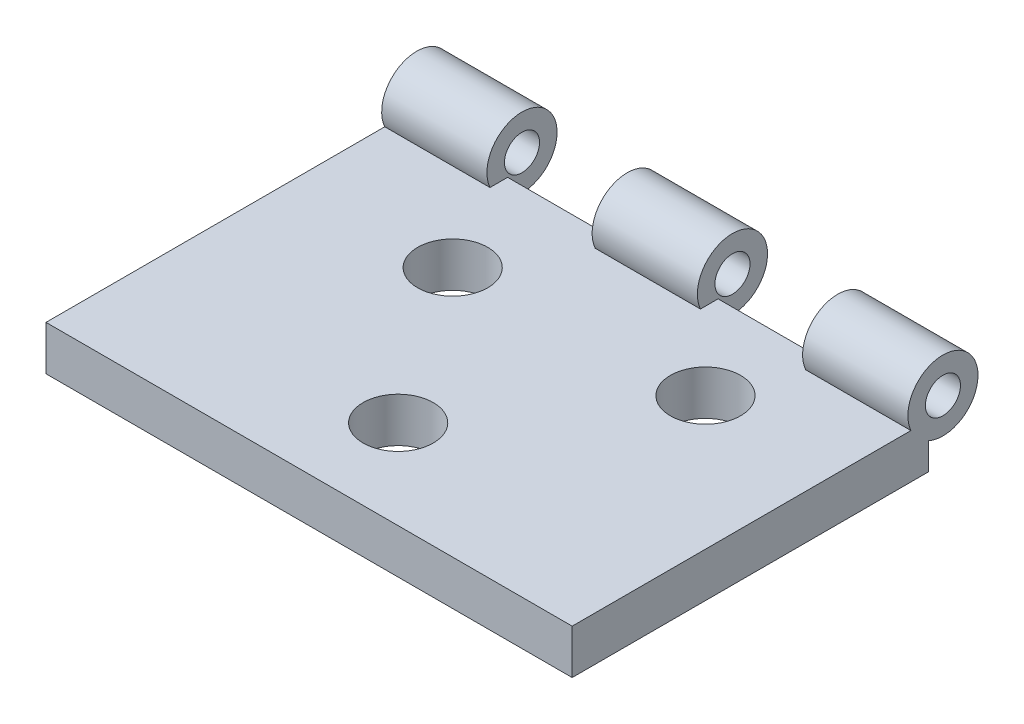
ISO-10303-21;
HEADER;
FILE_DESCRIPTION(('STEP AP214'),'2;1');
FILE_NAME('part.step','',(''),(''),'','','');
FILE_SCHEMA(('AUTOMOTIVE_DESIGN { 1 0 10303 214 1 1 1 1 }'));
ENDSEC;
DATA;
#1=APPLICATION_CONTEXT('core data for automotive mechanical design processes');
#2=APPLICATION_PROTOCOL_DEFINITION('international standard','automotive_design',2000,#1);
#3=PRODUCT_CONTEXT('',#1,'mechanical');
#4=PRODUCT('Part','Part','',(#3));
#5=PRODUCT_RELATED_PRODUCT_CATEGORY('part','',(#4));
#6=PRODUCT_DEFINITION_FORMATION('','',#4);
#7=PRODUCT_DEFINITION_CONTEXT('part definition',#1,'design');
#8=PRODUCT_DEFINITION('design','',#6,#7);
#9=PRODUCT_DEFINITION_SHAPE('','',#8);
#10=(LENGTH_UNIT() NAMED_UNIT(*) SI_UNIT(.MILLI.,.METRE.));
#11=(NAMED_UNIT(*) PLANE_ANGLE_UNIT() SI_UNIT($,.RADIAN.));
#12=(NAMED_UNIT(*) SI_UNIT($,.STERADIAN.) SOLID_ANGLE_UNIT());
#13=UNCERTAINTY_MEASURE_WITH_UNIT(LENGTH_MEASURE(1.E-05),#10,'distance_accuracy_value','');
#14=(GEOMETRIC_REPRESENTATION_CONTEXT(3) GLOBAL_UNCERTAINTY_ASSIGNED_CONTEXT((#13)) GLOBAL_UNIT_ASSIGNED_CONTEXT((#10,
#11,#12)) REPRESENTATION_CONTEXT('',''));
#15=CARTESIAN_POINT('',(0.,0.,0.));
#16=DIRECTION('',(0.,0.,1.));
#17=DIRECTION('',(1.,0.,0.));
#18=AXIS2_PLACEMENT_3D('',#15,#16,#17);
#19=CARTESIAN_POINT('',(0.,6.35,-25.4));
#20=DIRECTION('',(0.,0.,-1.));
#21=DIRECTION('',(-1.,0.,0.));
#22=AXIS2_PLACEMENT_3D('',#19,#20,#21);
#23=PLANE('',#22);
#24=DIRECTION('',(-1.,0.,0.));
#25=VECTOR('',#24,1.);
#26=CARTESIAN_POINT('',(37.5,3.83737281295908,-25.4));
#27=LINE('',#26,#25);
#28=CARTESIAN_POINT('',(37.5,3.83737281295907,-25.4));
#29=VERTEX_POINT('',#28);
#30=CARTESIAN_POINT('',(22.5,3.83737281295908,-25.4));
#31=VERTEX_POINT('',#30);
#32=EDGE_CURVE('E135',#29,#31,#27,.T.);
#33=ORIENTED_EDGE('',*,*,#32,.F.);
#34=DIRECTION('',(0.,-1.,0.));
#35=VECTOR('',#34,1.);
#36=CARTESIAN_POINT('',(37.5,6.35,-25.4));
#37=LINE('',#36,#35);
#38=CARTESIAN_POINT('',(37.5,0.,-25.4));
#39=VERTEX_POINT('',#38);
#40=EDGE_CURVE('E247',#29,#39,#37,.T.);
#41=ORIENTED_EDGE('',*,*,#40,.T.);
#42=DIRECTION('',(1.,0.,0.));
#43=VECTOR('',#42,1.);
#44=CARTESIAN_POINT('',(0.,0.,-25.4));
#45=LINE('',#44,#43);
#46=CARTESIAN_POINT('',(-37.5,0.,-25.4));
#47=VERTEX_POINT('',#46);
#48=EDGE_CURVE('E230',#47,#39,#45,.T.);
#49=ORIENTED_EDGE('',*,*,#48,.F.);
#50=DIRECTION('',(0.,-1.,0.));
#51=VECTOR('',#50,1.);
#52=CARTESIAN_POINT('',(-37.5,6.35,-25.4));
#53=LINE('',#52,#51);
#54=CARTESIAN_POINT('',(-37.5,3.83737281295908,-25.4));
#55=VERTEX_POINT('',#54);
#56=EDGE_CURVE('E219',#55,#47,#53,.T.);
#57=ORIENTED_EDGE('',*,*,#56,.F.);
#58=DIRECTION('',(-1.,0.,0.));
#59=VECTOR('',#58,1.);
#60=CARTESIAN_POINT('',(-22.5,3.83737281295908,-25.4));
#61=LINE('',#60,#59);
#62=CARTESIAN_POINT('',(-22.5,3.83737281295908,-25.4));
#63=VERTEX_POINT('',#62);
#64=EDGE_CURVE('E188',#63,#55,#61,.T.);
#65=ORIENTED_EDGE('',*,*,#64,.F.);
#66=DIRECTION('',(0.,1.,0.));
#67=VECTOR('',#66,1.);
#68=CARTESIAN_POINT('',(-22.5,6.35,-25.4));
#69=LINE('',#68,#67);
#70=CARTESIAN_POINT('',(-22.5,6.35,-25.4));
#71=VERTEX_POINT('',#70);
#72=EDGE_CURVE('E181',#63,#71,#69,.T.);
#73=ORIENTED_EDGE('',*,*,#72,.T.);
#74=DIRECTION('',(1.,0.,0.));
#75=VECTOR('',#74,1.);
#76=CARTESIAN_POINT('',(0.,6.35,-25.4));
#77=LINE('',#76,#75);
#78=CARTESIAN_POINT('',(-7.5,6.35,-25.4));
#79=VERTEX_POINT('',#78);
#80=EDGE_CURVE('E203',#71,#79,#77,.T.);
#81=ORIENTED_EDGE('',*,*,#80,.T.);
#82=DIRECTION('',(0.,1.,0.));
#83=VECTOR('',#82,1.);
#84=CARTESIAN_POINT('',(-7.5,6.35,-25.4));
#85=LINE('',#84,#83);
#86=CARTESIAN_POINT('',(-7.5,3.83737281295908,-25.4));
#87=VERTEX_POINT('',#86);
#88=EDGE_CURVE('E162',#87,#79,#85,.T.);
#89=ORIENTED_EDGE('',*,*,#88,.F.);
#90=DIRECTION('',(-1.,0.,0.));
#91=VECTOR('',#90,1.);
#92=CARTESIAN_POINT('',(7.5,3.83737281295908,-25.4));
#93=LINE('',#92,#91);
#94=CARTESIAN_POINT('',(7.5,3.83737281295908,-25.4));
#95=VERTEX_POINT('',#94);
#96=EDGE_CURVE('E172',#95,#87,#93,.T.);
#97=ORIENTED_EDGE('',*,*,#96,.F.);
#98=DIRECTION('',(0.,1.,0.));
#99=VECTOR('',#98,1.);
#100=CARTESIAN_POINT('',(7.5,6.35,-25.4));
#101=LINE('',#100,#99);
#102=CARTESIAN_POINT('',(7.5,6.35,-25.4));
#103=VERTEX_POINT('',#102);
#104=EDGE_CURVE('E169',#95,#103,#101,.T.);
#105=ORIENTED_EDGE('',*,*,#104,.T.);
#106=CARTESIAN_POINT('',(22.5,6.35,-25.4));
#107=VERTEX_POINT('',#106);
#108=EDGE_CURVE('E202',#103,#107,#77,.T.);
#109=ORIENTED_EDGE('',*,*,#108,.T.);
#110=DIRECTION('',(0.,1.,0.));
#111=VECTOR('',#110,1.);
#112=CARTESIAN_POINT('',(22.5,6.35,-25.4));
#113=LINE('',#112,#111);
#114=EDGE_CURVE('E60',#31,#107,#113,.T.);
#115=ORIENTED_EDGE('',*,*,#114,.F.);
#116=EDGE_LOOP('',(#33,#41,#49,#57,#65,#73,#81,#89,#97,#105,#109,#115));
#117=FACE_BOUND('',#116,.T.);
#118=ADVANCED_FACE('F43',(#117),#23,.T.);
#119=CARTESIAN_POINT('',(0.,6.35,0.));
#120=DIRECTION('',(0.,1.,0.));
#121=DIRECTION('',(0.,0.,1.));
#122=AXIS2_PLACEMENT_3D('',#119,#120,#121);
#123=PLANE('',#122);
#124=DIRECTION('',(-1.,0.,0.));
#125=VECTOR('',#124,1.);
#126=CARTESIAN_POINT('',(37.5,6.35,-22.8873728129591));
#127=LINE('',#126,#125);
#128=CARTESIAN_POINT('',(22.5,6.35,-22.8873728129591));
#129=VERTEX_POINT('',#128);
#130=CARTESIAN_POINT('',(37.5,6.35,-22.8873728129591));
#131=VERTEX_POINT('',#130);
#132=EDGE_CURVE('E125',#129,#131,#127,.F.);
#133=ORIENTED_EDGE('',*,*,#132,.F.);
#134=DIRECTION('',(0.,0.,1.));
#135=VECTOR('',#134,1.);
#136=CARTESIAN_POINT('',(22.5,6.35,0.));
#137=LINE('',#136,#135);
#138=EDGE_CURVE('E11',#107,#129,#137,.T.);
#139=ORIENTED_EDGE('',*,*,#138,.F.);
#140=ORIENTED_EDGE('',*,*,#108,.F.);
#141=DIRECTION('',(0.,0.,1.));
#142=VECTOR('',#141,1.);
#143=CARTESIAN_POINT('',(7.5,6.35,0.));
#144=LINE('',#143,#142);
#145=CARTESIAN_POINT('',(7.5,6.35,-22.8873728129591));
#146=VERTEX_POINT('',#145);
#147=EDGE_CURVE('E53',#103,#146,#144,.T.);
#148=ORIENTED_EDGE('',*,*,#147,.T.);
#149=DIRECTION('',(-1.,0.,0.));
#150=VECTOR('',#149,1.);
#151=CARTESIAN_POINT('',(7.5,6.35,-22.8873728129591));
#152=LINE('',#151,#150);
#153=CARTESIAN_POINT('',(-7.5,6.35,-22.8873728129591));
#154=VERTEX_POINT('',#153);
#155=EDGE_CURVE('E268',#154,#146,#152,.F.);
#156=ORIENTED_EDGE('',*,*,#155,.F.);
#157=DIRECTION('',(0.,0.,1.));
#158=VECTOR('',#157,1.);
#159=CARTESIAN_POINT('',(-7.5,6.35,0.));
#160=LINE('',#159,#158);
#161=EDGE_CURVE('E264',#79,#154,#160,.T.);
#162=ORIENTED_EDGE('',*,*,#161,.F.);
#163=ORIENTED_EDGE('',*,*,#80,.F.);
#164=DIRECTION('',(0.,0.,1.));
#165=VECTOR('',#164,1.);
#166=CARTESIAN_POINT('',(-22.5,6.35,0.));
#167=LINE('',#166,#165);
#168=CARTESIAN_POINT('',(-22.5,6.35,-22.8873728129591));
#169=VERTEX_POINT('',#168);
#170=EDGE_CURVE('E257',#71,#169,#167,.T.);
#171=ORIENTED_EDGE('',*,*,#170,.T.);
#172=DIRECTION('',(-1.,0.,0.));
#173=VECTOR('',#172,1.);
#174=CARTESIAN_POINT('',(-22.5,6.35,-22.8873728129591));
#175=LINE('',#174,#173);
#176=CARTESIAN_POINT('',(-37.5,6.35,-22.8873728129591));
#177=VERTEX_POINT('',#176);
#178=EDGE_CURVE('E261',#177,#169,#175,.F.);
#179=ORIENTED_EDGE('',*,*,#178,.F.);
#180=DIRECTION('',(0.,0.,-1.));
#181=VECTOR('',#180,1.);
#182=CARTESIAN_POINT('',(-37.5,6.35,0.));
#183=LINE('',#182,#181);
#184=CARTESIAN_POINT('',(-37.5,6.35,25.4));
#185=VERTEX_POINT('',#184);
#186=EDGE_CURVE('E192',#185,#177,#183,.T.);
#187=ORIENTED_EDGE('',*,*,#186,.F.);
#188=DIRECTION('',(1.,0.,0.));
#189=VECTOR('',#188,1.);
#190=CARTESIAN_POINT('',(0.,6.35,25.4));
#191=LINE('',#190,#189);
#192=CARTESIAN_POINT('',(37.5,6.35,25.4));
#193=VERTEX_POINT('',#192);
#194=EDGE_CURVE('E196',#185,#193,#191,.T.);
#195=ORIENTED_EDGE('',*,*,#194,.T.);
#196=DIRECTION('',(0.,0.,-1.));
#197=VECTOR('',#196,1.);
#198=CARTESIAN_POINT('',(37.5,6.35,0.));
#199=LINE('',#198,#197);
#200=EDGE_CURVE('E129',#193,#131,#199,.T.);
#201=ORIENTED_EDGE('',*,*,#200,.T.);
#202=EDGE_LOOP('',(#133,#139,#140,#148,#156,#162,#163,#171,#179,#187,#195,#201));
#203=FACE_BOUND('',#202,.T.);
#204=CARTESIAN_POINT('',(0.,6.35,12.7));
#205=DIRECTION('',(0.,1.,0.));
#206=DIRECTION('',(0.,0.,1.));
#207=AXIS2_PLACEMENT_3D('',#204,#205,#206);
#208=CIRCLE('',#207,5.);
#209=CARTESIAN_POINT('',(0.,6.35,17.7));
#210=VERTEX_POINT('',#209);
#211=EDGE_CURVE('E207',#210,#210,#208,.T.);
#212=ORIENTED_EDGE('',*,*,#211,.F.);
#213=EDGE_LOOP('',(#212));
#214=FACE_BOUND('',#213,.T.);
#215=CARTESIAN_POINT('',(18.5438369736078,6.35,-12.5603589101237));
#216=DIRECTION('',(0.,1.,0.));
#217=DIRECTION('',(0.,0.,1.));
#218=AXIS2_PLACEMENT_3D('',#215,#216,#217);
#219=CIRCLE('',#218,5.);
#220=CARTESIAN_POINT('',(18.5438369736078,6.35,-7.56035891012367));
#221=VERTEX_POINT('',#220);
#222=EDGE_CURVE('E211',#221,#221,#219,.T.);
#223=ORIENTED_EDGE('',*,*,#222,.F.);
#224=EDGE_LOOP('',(#223));
#225=FACE_BOUND('',#224,.T.);
#226=CARTESIAN_POINT('',(-15.2791730334857,6.35,-10.3490932013476));
#227=DIRECTION('',(0.,1.,0.));
#228=DIRECTION('',(0.,0.,1.));
#229=AXIS2_PLACEMENT_3D('',#226,#227,#228);
#230=CIRCLE('',#229,5.);
#231=CARTESIAN_POINT('',(-15.2791730334857,6.35,-5.34909320134763));
#232=VERTEX_POINT('',#231);
#233=EDGE_CURVE('E215',#232,#232,#230,.T.);
#234=ORIENTED_EDGE('',*,*,#233,.F.);
#235=EDGE_LOOP('',(#234));
#236=FACE_BOUND('',#235,.T.);
#237=ADVANCED_FACE('F126',(#203,#214,#225,#236),#123,.T.);
#238=CARTESIAN_POINT('',(-37.5,6.35,0.));
#239=DIRECTION('',(-1.,0.,0.));
#240=DIRECTION('',(0.,0.,1.));
#241=AXIS2_PLACEMENT_3D('',#238,#239,#240);
#242=PLANE('',#241);
#243=CARTESIAN_POINT('',(-37.5,8.39848233886866,-27.4484823388687));
#244=DIRECTION('',(-1.,0.,0.));
#245=DIRECTION('',(0.,0.,1.));
#246=AXIS2_PLACEMENT_3D('',#243,#244,#245);
#247=CIRCLE('',#246,2.5);
#248=CARTESIAN_POINT('',(-37.5,8.39848233886866,-24.9484823388687));
#249=VERTEX_POINT('',#248);
#250=EDGE_CURVE('E346',#249,#249,#247,.T.);
#251=ORIENTED_EDGE('',*,*,#250,.F.);
#252=EDGE_LOOP('',(#251));
#253=FACE_BOUND('',#252,.T.);
#254=ORIENTED_EDGE('',*,*,#186,.T.);
#255=CARTESIAN_POINT('',(-37.5,8.39848233886866,-27.4484823388687));
#256=DIRECTION('',(-1.,0.,0.));
#257=DIRECTION('',(0.,0.,1.));
#258=AXIS2_PLACEMENT_3D('',#255,#256,#257);
#259=CIRCLE('',#258,5.);
#260=EDGE_CURVE('E176',#177,#55,#259,.T.);
#261=ORIENTED_EDGE('',*,*,#260,.T.);
#262=ORIENTED_EDGE('',*,*,#56,.T.);
#263=DIRECTION('',(0.,0.,-1.));
#264=VECTOR('',#263,1.);
#265=CARTESIAN_POINT('',(-37.5,0.,0.));
#266=LINE('',#265,#264);
#267=CARTESIAN_POINT('',(-37.5,0.,25.4));
#268=VERTEX_POINT('',#267);
#269=EDGE_CURVE('E191',#268,#47,#266,.T.);
#270=ORIENTED_EDGE('',*,*,#269,.F.);
#271=DIRECTION('',(0.,-1.,0.));
#272=VECTOR('',#271,1.);
#273=CARTESIAN_POINT('',(-37.5,6.35,25.4));
#274=LINE('',#273,#272);
#275=EDGE_CURVE('E254',#185,#268,#274,.T.);
#276=ORIENTED_EDGE('',*,*,#275,.F.);
#277=EDGE_LOOP('',(#254,#261,#262,#270,#276));
#278=FACE_BOUND('',#277,.T.);
#279=ADVANCED_FACE('F45',(#253,#278),#242,.T.);
#280=CARTESIAN_POINT('',(0.,6.35,25.4));
#281=DIRECTION('',(0.,0.,-1.));
#282=DIRECTION('',(-1.,0.,0.));
#283=AXIS2_PLACEMENT_3D('',#280,#281,#282);
#284=PLANE('',#283);
#285=DIRECTION('',(1.,0.,0.));
#286=VECTOR('',#285,1.);
#287=CARTESIAN_POINT('',(0.,0.,25.4));
#288=LINE('',#287,#286);
#289=CARTESIAN_POINT('',(37.5,0.,25.4));
#290=VERTEX_POINT('',#289);
#291=EDGE_CURVE('E223',#268,#290,#288,.T.);
#292=ORIENTED_EDGE('',*,*,#291,.T.);
#293=DIRECTION('',(0.,-1.,0.));
#294=VECTOR('',#293,1.);
#295=CARTESIAN_POINT('',(37.5,6.35,25.4));
#296=LINE('',#295,#294);
#297=EDGE_CURVE('E250',#193,#290,#296,.T.);
#298=ORIENTED_EDGE('',*,*,#297,.F.);
#299=ORIENTED_EDGE('',*,*,#194,.F.);
#300=ORIENTED_EDGE('',*,*,#275,.T.);
#301=EDGE_LOOP('',(#292,#298,#299,#300));
#302=FACE_BOUND('',#301,.T.);
#303=ADVANCED_FACE('F299',(#302),#284,.F.);
#304=CARTESIAN_POINT('',(37.5,6.35,0.));
#305=DIRECTION('',(-1.,0.,0.));
#306=DIRECTION('',(0.,0.,1.));
#307=AXIS2_PLACEMENT_3D('',#304,#305,#306);
#308=PLANE('',#307);
#309=CARTESIAN_POINT('',(37.5,8.39848233886866,-27.4484823388687));
#310=DIRECTION('',(-1.,0.,0.));
#311=DIRECTION('',(0.,0.,1.));
#312=AXIS2_PLACEMENT_3D('',#309,#310,#311);
#313=CIRCLE('',#312,2.5);
#314=CARTESIAN_POINT('',(37.5,8.39848233886866,-24.9484823388687));
#315=VERTEX_POINT('',#314);
#316=EDGE_CURVE('E349',#315,#315,#313,.T.);
#317=ORIENTED_EDGE('',*,*,#316,.T.);
#318=EDGE_LOOP('',(#317));
#319=FACE_BOUND('',#318,.T.);
#320=ORIENTED_EDGE('',*,*,#40,.F.);
#321=CARTESIAN_POINT('',(37.5,8.39848233886866,-27.4484823388687));
#322=DIRECTION('',(-1.,0.,0.));
#323=DIRECTION('',(0.,0.,1.));
#324=AXIS2_PLACEMENT_3D('',#321,#322,#323);
#325=CIRCLE('',#324,5.);
#326=EDGE_CURVE('E136',#131,#29,#325,.T.);
#327=ORIENTED_EDGE('',*,*,#326,.F.);
#328=ORIENTED_EDGE('',*,*,#200,.F.);
#329=ORIENTED_EDGE('',*,*,#297,.T.);
#330=DIRECTION('',(0.,0.,-1.));
#331=VECTOR('',#330,1.);
#332=CARTESIAN_POINT('',(37.5,0.,0.));
#333=LINE('',#332,#331);
#334=EDGE_CURVE('E226',#290,#39,#333,.T.);
#335=ORIENTED_EDGE('',*,*,#334,.T.);
#336=EDGE_LOOP('',(#320,#327,#328,#329,#335));
#337=FACE_BOUND('',#336,.T.);
#338=ADVANCED_FACE('F303',(#319,#337),#308,.F.);
#339=CARTESIAN_POINT('',(18.5438369736078,6.35,-12.5603589101237));
#340=DIRECTION('',(0.,-1.,0.));
#341=DIRECTION('',(0.,0.,-1.));
#342=AXIS2_PLACEMENT_3D('',#339,#340,#341);
#343=CYLINDRICAL_SURFACE('',#342,5.);
#344=ORIENTED_EDGE('',*,*,#222,.T.);
#345=EDGE_LOOP('',(#344));
#346=FACE_BOUND('',#345,.T.);
#347=CARTESIAN_POINT('',(18.5438369736078,0.,-12.5603589101237));
#348=DIRECTION('',(0.,1.,0.));
#349=DIRECTION('',(0.,0.,1.));
#350=AXIS2_PLACEMENT_3D('',#347,#348,#349);
#351=CIRCLE('',#350,5.);
#352=CARTESIAN_POINT('',(18.5438369736078,0.,-7.56035891012367));
#353=VERTEX_POINT('',#352);
#354=EDGE_CURVE('E238',#353,#353,#351,.T.);
#355=ORIENTED_EDGE('',*,*,#354,.F.);
#356=EDGE_LOOP('',(#355));
#357=FACE_BOUND('',#356,.T.);
#358=ADVANCED_FACE('F324',(#346,#357),#343,.F.);
#359=CARTESIAN_POINT('',(0.,6.35,12.7));
#360=DIRECTION('',(0.,-1.,0.));
#361=DIRECTION('',(0.,0.,-1.));
#362=AXIS2_PLACEMENT_3D('',#359,#360,#361);
#363=CYLINDRICAL_SURFACE('',#362,5.);
#364=ORIENTED_EDGE('',*,*,#211,.T.);
#365=EDGE_LOOP('',(#364));
#366=FACE_BOUND('',#365,.T.);
#367=CARTESIAN_POINT('',(0.,0.,12.7));
#368=DIRECTION('',(0.,1.,0.));
#369=DIRECTION('',(0.,0.,1.));
#370=AXIS2_PLACEMENT_3D('',#367,#368,#369);
#371=CIRCLE('',#370,5.);
#372=CARTESIAN_POINT('',(0.,0.,17.7));
#373=VERTEX_POINT('',#372);
#374=EDGE_CURVE('E234',#373,#373,#371,.T.);
#375=ORIENTED_EDGE('',*,*,#374,.F.);
#376=EDGE_LOOP('',(#375));
#377=FACE_BOUND('',#376,.T.);
#378=ADVANCED_FACE('F318',(#366,#377),#363,.F.);
#379=CARTESIAN_POINT('',(-15.2791730334857,6.35,-10.3490932013476));
#380=DIRECTION('',(0.,-1.,0.));
#381=DIRECTION('',(0.,0.,-1.));
#382=AXIS2_PLACEMENT_3D('',#379,#380,#381);
#383=CYLINDRICAL_SURFACE('',#382,5.);
#384=ORIENTED_EDGE('',*,*,#233,.T.);
#385=EDGE_LOOP('',(#384));
#386=FACE_BOUND('',#385,.T.);
#387=CARTESIAN_POINT('',(-15.2791730334857,0.,-10.3490932013476));
#388=DIRECTION('',(0.,1.,0.));
#389=DIRECTION('',(0.,0.,1.));
#390=AXIS2_PLACEMENT_3D('',#387,#388,#389);
#391=CIRCLE('',#390,5.);
#392=CARTESIAN_POINT('',(-15.2791730334857,0.,-5.34909320134763));
#393=VERTEX_POINT('',#392);
#394=EDGE_CURVE('E197',#393,#393,#391,.T.);
#395=ORIENTED_EDGE('',*,*,#394,.F.);
#396=EDGE_LOOP('',(#395));
#397=FACE_BOUND('',#396,.T.);
#398=ADVANCED_FACE('F309',(#386,#397),#383,.F.);
#399=CARTESIAN_POINT('',(0.,0.,0.));
#400=DIRECTION('',(0.,1.,0.));
#401=DIRECTION('',(0.,0.,1.));
#402=AXIS2_PLACEMENT_3D('',#399,#400,#401);
#403=PLANE('',#402);
#404=ORIENTED_EDGE('',*,*,#269,.T.);
#405=ORIENTED_EDGE('',*,*,#48,.T.);
#406=ORIENTED_EDGE('',*,*,#334,.F.);
#407=ORIENTED_EDGE('',*,*,#291,.F.);
#408=EDGE_LOOP('',(#404,#405,#406,#407));
#409=FACE_BOUND('',#408,.T.);
#410=ORIENTED_EDGE('',*,*,#374,.T.);
#411=EDGE_LOOP('',(#410));
#412=FACE_BOUND('',#411,.T.);
#413=ORIENTED_EDGE('',*,*,#354,.T.);
#414=EDGE_LOOP('',(#413));
#415=FACE_BOUND('',#414,.T.);
#416=ORIENTED_EDGE('',*,*,#394,.T.);
#417=EDGE_LOOP('',(#416));
#418=FACE_BOUND('',#417,.T.);
#419=ADVANCED_FACE('F306',(#409,#412,#415,#418),#403,.F.);
#420=CARTESIAN_POINT('',(-22.5,8.39848233886866,-27.4484823388687));
#421=DIRECTION('',(-1.,0.,0.));
#422=DIRECTION('',(0.,0.,1.));
#423=AXIS2_PLACEMENT_3D('',#420,#421,#422);
#424=CYLINDRICAL_SURFACE('',#423,5.);
#425=CARTESIAN_POINT('',(-22.5,8.39848233886866,-27.4484823388687));
#426=DIRECTION('',(-1.,0.,0.));
#427=DIRECTION('',(0.,0.,1.));
#428=AXIS2_PLACEMENT_3D('',#425,#426,#427);
#429=CIRCLE('',#428,5.);
#430=EDGE_CURVE('E177',#169,#63,#429,.T.);
#431=ORIENTED_EDGE('',*,*,#430,.T.);
#432=ORIENTED_EDGE('',*,*,#64,.T.);
#433=ORIENTED_EDGE('',*,*,#260,.F.);
#434=ORIENTED_EDGE('',*,*,#178,.T.);
#435=EDGE_LOOP('',(#431,#432,#433,#434));
#436=FACE_BOUND('',#435,.T.);
#437=ADVANCED_FACE('F290',(#436),#424,.T.);
#438=CARTESIAN_POINT('',(-22.5,8.39848233886866,-27.4484823388687));
#439=DIRECTION('',(-1.,0.,0.));
#440=DIRECTION('',(0.,0.,1.));
#441=AXIS2_PLACEMENT_3D('',#438,#439,#440);
#442=PLANE('',#441);
#443=CARTESIAN_POINT('',(-22.5,8.39848233886866,-27.4484823388687));
#444=DIRECTION('',(-1.,0.,0.));
#445=DIRECTION('',(0.,0.,1.));
#446=AXIS2_PLACEMENT_3D('',#443,#444,#445);
#447=CIRCLE('',#446,2.5);
#448=CARTESIAN_POINT('',(-22.5,8.39848233886866,-24.9484823388687));
#449=VERTEX_POINT('',#448);
#450=EDGE_CURVE('E144',#449,#449,#447,.T.);
#451=ORIENTED_EDGE('',*,*,#450,.T.);
#452=EDGE_LOOP('',(#451));
#453=FACE_BOUND('',#452,.T.);
#454=ORIENTED_EDGE('',*,*,#72,.F.);
#455=ORIENTED_EDGE('',*,*,#430,.F.);
#456=ORIENTED_EDGE('',*,*,#170,.F.);
#457=EDGE_LOOP('',(#454,#455,#456));
#458=FACE_BOUND('',#457,.T.);
#459=ADVANCED_FACE('F288',(#453,#458),#442,.F.);
#460=CARTESIAN_POINT('',(7.5,8.39848233886866,-27.4484823388687));
#461=DIRECTION('',(-1.,0.,0.));
#462=DIRECTION('',(0.,0.,1.));
#463=AXIS2_PLACEMENT_3D('',#460,#461,#462);
#464=CYLINDRICAL_SURFACE('',#463,5.);
#465=CARTESIAN_POINT('',(7.5,8.39848233886866,-27.4484823388687));
#466=DIRECTION('',(-1.,0.,0.));
#467=DIRECTION('',(0.,0.,1.));
#468=AXIS2_PLACEMENT_3D('',#465,#466,#467);
#469=CIRCLE('',#468,5.);
#470=EDGE_CURVE('E158',#146,#95,#469,.T.);
#471=ORIENTED_EDGE('',*,*,#470,.T.);
#472=ORIENTED_EDGE('',*,*,#96,.T.);
#473=CARTESIAN_POINT('',(-7.5,8.39848233886866,-27.4484823388687));
#474=DIRECTION('',(-1.,0.,0.));
#475=DIRECTION('',(0.,0.,1.));
#476=AXIS2_PLACEMENT_3D('',#473,#474,#475);
#477=CIRCLE('',#476,5.);
#478=EDGE_CURVE('E157',#154,#87,#477,.T.);
#479=ORIENTED_EDGE('',*,*,#478,.F.);
#480=ORIENTED_EDGE('',*,*,#155,.T.);
#481=EDGE_LOOP('',(#471,#472,#479,#480));
#482=FACE_BOUND('',#481,.T.);
#483=ADVANCED_FACE('F279',(#482),#464,.T.);
#484=CARTESIAN_POINT('',(7.5,8.39848233886866,-27.4484823388687));
#485=DIRECTION('',(-1.,0.,0.));
#486=DIRECTION('',(0.,0.,1.));
#487=AXIS2_PLACEMENT_3D('',#484,#485,#486);
#488=PLANE('',#487);
#489=CARTESIAN_POINT('',(7.5,8.39848233886866,-27.4484823388687));
#490=DIRECTION('',(-1.,0.,0.));
#491=DIRECTION('',(0.,0.,1.));
#492=AXIS2_PLACEMENT_3D('',#489,#490,#491);
#493=CIRCLE('',#492,2.5);
#494=CARTESIAN_POINT('',(7.5,8.39848233886866,-24.9484823388687));
#495=VERTEX_POINT('',#494);
#496=EDGE_CURVE('E150',#495,#495,#493,.T.);
#497=ORIENTED_EDGE('',*,*,#496,.T.);
#498=EDGE_LOOP('',(#497));
#499=FACE_BOUND('',#498,.T.);
#500=ORIENTED_EDGE('',*,*,#104,.F.);
#501=ORIENTED_EDGE('',*,*,#470,.F.);
#502=ORIENTED_EDGE('',*,*,#147,.F.);
#503=EDGE_LOOP('',(#500,#501,#502));
#504=FACE_BOUND('',#503,.T.);
#505=ADVANCED_FACE('F280',(#499,#504),#488,.F.);
#506=CARTESIAN_POINT('',(-7.5,8.39848233886866,-27.4484823388687));
#507=DIRECTION('',(-1.,0.,0.));
#508=DIRECTION('',(0.,0.,1.));
#509=AXIS2_PLACEMENT_3D('',#506,#507,#508);
#510=PLANE('',#509);
#511=CARTESIAN_POINT('',(-7.5,8.39848233886866,-27.4484823388687));
#512=DIRECTION('',(-1.,0.,0.));
#513=DIRECTION('',(0.,0.,1.));
#514=AXIS2_PLACEMENT_3D('',#511,#512,#513);
#515=CIRCLE('',#514,2.5);
#516=CARTESIAN_POINT('',(-7.5,8.39848233886866,-24.9484823388687));
#517=VERTEX_POINT('',#516);
#518=EDGE_CURVE('E355',#517,#517,#515,.T.);
#519=ORIENTED_EDGE('',*,*,#518,.F.);
#520=EDGE_LOOP('',(#519));
#521=FACE_BOUND('',#520,.T.);
#522=ORIENTED_EDGE('',*,*,#478,.T.);
#523=ORIENTED_EDGE('',*,*,#88,.T.);
#524=ORIENTED_EDGE('',*,*,#161,.T.);
#525=EDGE_LOOP('',(#522,#523,#524));
#526=FACE_BOUND('',#525,.T.);
#527=ADVANCED_FACE('F282',(#521,#526),#510,.T.);
#528=CARTESIAN_POINT('',(37.5,8.39848233886866,-27.4484823388687));
#529=DIRECTION('',(-1.,0.,0.));
#530=DIRECTION('',(0.,0.,1.));
#531=AXIS2_PLACEMENT_3D('',#528,#529,#530);
#532=CYLINDRICAL_SURFACE('',#531,5.);
#533=ORIENTED_EDGE('',*,*,#326,.T.);
#534=ORIENTED_EDGE('',*,*,#32,.T.);
#535=CARTESIAN_POINT('',(22.5,8.39848233886866,-27.4484823388687));
#536=DIRECTION('',(-1.,0.,0.));
#537=DIRECTION('',(0.,0.,1.));
#538=AXIS2_PLACEMENT_3D('',#535,#536,#537);
#539=CIRCLE('',#538,5.);
#540=EDGE_CURVE('E141',#129,#31,#539,.T.);
#541=ORIENTED_EDGE('',*,*,#540,.F.);
#542=ORIENTED_EDGE('',*,*,#132,.T.);
#543=EDGE_LOOP('',(#533,#534,#541,#542));
#544=FACE_BOUND('',#543,.T.);
#545=ADVANCED_FACE('F142',(#544),#532,.T.);
#546=CARTESIAN_POINT('',(22.5,8.39848233886866,-27.4484823388687));
#547=DIRECTION('',(-1.,0.,0.));
#548=DIRECTION('',(0.,0.,1.));
#549=AXIS2_PLACEMENT_3D('',#546,#547,#548);
#550=PLANE('',#549);
#551=CARTESIAN_POINT('',(22.5,8.39848233886866,-27.4484823388687));
#552=DIRECTION('',(-1.,0.,0.));
#553=DIRECTION('',(0.,0.,1.));
#554=AXIS2_PLACEMENT_3D('',#551,#552,#553);
#555=CIRCLE('',#554,2.5);
#556=CARTESIAN_POINT('',(22.5,8.39848233886866,-24.9484823388687));
#557=VERTEX_POINT('',#556);
#558=EDGE_CURVE('E47',#557,#557,#555,.T.);
#559=ORIENTED_EDGE('',*,*,#558,.F.);
#560=EDGE_LOOP('',(#559));
#561=FACE_BOUND('',#560,.T.);
#562=ORIENTED_EDGE('',*,*,#540,.T.);
#563=ORIENTED_EDGE('',*,*,#114,.T.);
#564=ORIENTED_EDGE('',*,*,#138,.T.);
#565=EDGE_LOOP('',(#562,#563,#564));
#566=FACE_BOUND('',#565,.T.);
#567=ADVANCED_FACE('F140',(#561,#566),#550,.T.);
#568=CARTESIAN_POINT('',(37.5,8.39848233886866,-27.4484823388687));
#569=DIRECTION('',(-1.,0.,0.));
#570=DIRECTION('',(0.,0.,1.));
#571=AXIS2_PLACEMENT_3D('',#568,#569,#570);
#572=CYLINDRICAL_SURFACE('',#571,2.5);
#573=ORIENTED_EDGE('',*,*,#558,.T.);
#574=EDGE_LOOP('',(#573));
#575=FACE_BOUND('',#574,.T.);
#576=ORIENTED_EDGE('',*,*,#316,.F.);
#577=EDGE_LOOP('',(#576));
#578=FACE_BOUND('',#577,.T.);
#579=ADVANCED_FACE('F367',(#575,#578),#572,.F.);
#580=ORIENTED_EDGE('',*,*,#518,.T.);
#581=EDGE_LOOP('',(#580));
#582=FACE_BOUND('',#581,.T.);
#583=ORIENTED_EDGE('',*,*,#496,.F.);
#584=EDGE_LOOP('',(#583));
#585=FACE_BOUND('',#584,.T.);
#586=ADVANCED_FACE('F364',(#582,#585),#572,.F.);
#587=ORIENTED_EDGE('',*,*,#250,.T.);
#588=EDGE_LOOP('',(#587));
#589=FACE_BOUND('',#588,.T.);
#590=ORIENTED_EDGE('',*,*,#450,.F.);
#591=EDGE_LOOP('',(#590));
#592=FACE_BOUND('',#591,.T.);
#593=ADVANCED_FACE('F366',(#589,#592),#572,.F.);
#594=CLOSED_SHELL('',(#118,#237,#279,#303,#338,#358,#378,#398,#419,#437,#459,#483,#505,#527,
#545,#567,#579,#586,#593));
#595=MANIFOLD_SOLID_BREP('B2',#594);
#596=ADVANCED_BREP_SHAPE_REPRESENTATION('',(#18,#595),#14);
#597=SHAPE_DEFINITION_REPRESENTATION(#9,#596);
ENDSEC;
END-ISO-10303-21;
